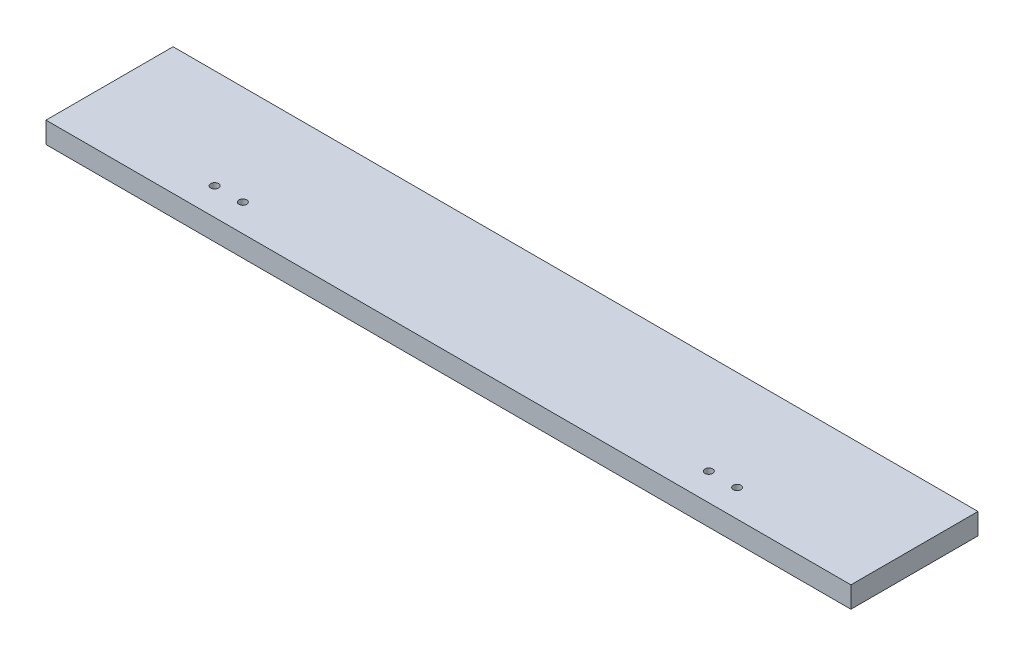
ISO-10303-21;
HEADER;
FILE_DESCRIPTION(('STEP AP214'),'2;1');
FILE_NAME('part.step','',(''),(''),'','','');
FILE_SCHEMA(('AUTOMOTIVE_DESIGN { 1 0 10303 214 1 1 1 1 }'));
ENDSEC;
DATA;
#1=APPLICATION_CONTEXT('core data for automotive mechanical design processes');
#2=APPLICATION_PROTOCOL_DEFINITION('international standard','automotive_design',2000,#1);
#3=PRODUCT_CONTEXT('',#1,'mechanical');
#4=PRODUCT('Part','Part','',(#3));
#5=PRODUCT_RELATED_PRODUCT_CATEGORY('part','',(#4));
#6=PRODUCT_DEFINITION_FORMATION('','',#4);
#7=PRODUCT_DEFINITION_CONTEXT('part definition',#1,'design');
#8=PRODUCT_DEFINITION('design','',#6,#7);
#9=PRODUCT_DEFINITION_SHAPE('','',#8);
#10=(LENGTH_UNIT() NAMED_UNIT(*) SI_UNIT(.MILLI.,.METRE.));
#11=(NAMED_UNIT(*) PLANE_ANGLE_UNIT() SI_UNIT($,.RADIAN.));
#12=(NAMED_UNIT(*) SI_UNIT($,.STERADIAN.) SOLID_ANGLE_UNIT());
#13=UNCERTAINTY_MEASURE_WITH_UNIT(LENGTH_MEASURE(1.E-05),#10,'distance_accuracy_value','');
#14=(GEOMETRIC_REPRESENTATION_CONTEXT(3) GLOBAL_UNCERTAINTY_ASSIGNED_CONTEXT((#13)) GLOBAL_UNIT_ASSIGNED_CONTEXT((#10,
#11,#12)) REPRESENTATION_CONTEXT('',''));
#15=CARTESIAN_POINT('',(0.,0.,0.));
#16=DIRECTION('',(0.,0.,1.));
#17=DIRECTION('',(1.,0.,0.));
#18=AXIS2_PLACEMENT_3D('',#15,#16,#17);
#19=CARTESIAN_POINT('',(361.949999999999,19.05,57.15));
#20=DIRECTION('',(-1.,0.,0.));
#21=DIRECTION('',(0.,0.,1.));
#22=AXIS2_PLACEMENT_3D('',#19,#20,#21);
#23=PLANE('',#22);
#24=DIRECTION('',(0.,0.,-1.));
#25=VECTOR('',#24,1.);
#26=CARTESIAN_POINT('',(361.949999999999,0.,57.15));
#27=LINE('',#26,#25);
#28=CARTESIAN_POINT('',(361.949999999999,0.,57.15));
#29=VERTEX_POINT('',#28);
#30=CARTESIAN_POINT('',(361.949999999999,0.,-57.15));
#31=VERTEX_POINT('',#30);
#32=EDGE_CURVE('E103',#29,#31,#27,.T.);
#33=ORIENTED_EDGE('',*,*,#32,.T.);
#34=DIRECTION('',(0.,-1.,0.));
#35=VECTOR('',#34,1.);
#36=CARTESIAN_POINT('',(361.949999999999,19.05,-57.15));
#37=LINE('',#36,#35);
#38=CARTESIAN_POINT('',(361.949999999999,19.05,-57.15));
#39=VERTEX_POINT('',#38);
#40=EDGE_CURVE('E11',#39,#31,#37,.T.);
#41=ORIENTED_EDGE('',*,*,#40,.F.);
#42=DIRECTION('',(0.,0.,-1.));
#43=VECTOR('',#42,1.);
#44=CARTESIAN_POINT('',(361.949999999999,19.05,57.15));
#45=LINE('',#44,#43);
#46=CARTESIAN_POINT('',(361.949999999999,19.05,57.15));
#47=VERTEX_POINT('',#46);
#48=EDGE_CURVE('E91',#47,#39,#45,.T.);
#49=ORIENTED_EDGE('',*,*,#48,.F.);
#50=DIRECTION('',(0.,-1.,0.));
#51=VECTOR('',#50,1.);
#52=CARTESIAN_POINT('',(361.949999999999,19.05,57.15));
#53=LINE('',#52,#51);
#54=EDGE_CURVE('E99',#47,#29,#53,.T.);
#55=ORIENTED_EDGE('',*,*,#54,.T.);
#56=EDGE_LOOP('',(#33,#41,#49,#55));
#57=FACE_BOUND('',#56,.T.);
#58=ADVANCED_FACE('F40',(#57),#23,.F.);
#59=CARTESIAN_POINT('',(-361.950000000001,19.05,-57.15));
#60=DIRECTION('',(0.,0.,1.));
#61=DIRECTION('',(1.,0.,0.));
#62=AXIS2_PLACEMENT_3D('',#59,#60,#61);
#63=PLANE('',#62);
#64=DIRECTION('',(-1.,0.,0.));
#65=VECTOR('',#64,1.);
#66=CARTESIAN_POINT('',(-361.950000000001,0.,-57.15));
#67=LINE('',#66,#65);
#68=CARTESIAN_POINT('',(-361.950000000001,0.,-57.15));
#69=VERTEX_POINT('',#68);
#70=EDGE_CURVE('E95',#31,#69,#67,.T.);
#71=ORIENTED_EDGE('',*,*,#70,.T.);
#72=DIRECTION('',(0.,-1.,0.));
#73=VECTOR('',#72,1.);
#74=CARTESIAN_POINT('',(-361.950000000001,19.05,-57.15));
#75=LINE('',#74,#73);
#76=CARTESIAN_POINT('',(-361.950000000001,19.05,-57.15));
#77=VERTEX_POINT('',#76);
#78=EDGE_CURVE('E48',#77,#69,#75,.T.);
#79=ORIENTED_EDGE('',*,*,#78,.F.);
#80=DIRECTION('',(-1.,0.,0.));
#81=VECTOR('',#80,1.);
#82=CARTESIAN_POINT('',(-361.950000000001,19.05,-57.15));
#83=LINE('',#82,#81);
#84=EDGE_CURVE('E86',#39,#77,#83,.T.);
#85=ORIENTED_EDGE('',*,*,#84,.F.);
#86=ORIENTED_EDGE('',*,*,#40,.T.);
#87=EDGE_LOOP('',(#71,#79,#85,#86));
#88=FACE_BOUND('',#87,.T.);
#89=ADVANCED_FACE('F94',(#88),#63,.F.);
#90=CARTESIAN_POINT('',(-361.950000000001,19.05,57.15));
#91=DIRECTION('',(1.,0.,0.));
#92=DIRECTION('',(0.,0.,-1.));
#93=AXIS2_PLACEMENT_3D('',#90,#91,#92);
#94=PLANE('',#93);
#95=DIRECTION('',(0.,0.,1.));
#96=VECTOR('',#95,1.);
#97=CARTESIAN_POINT('',(-361.950000000001,0.,57.15));
#98=LINE('',#97,#96);
#99=CARTESIAN_POINT('',(-361.950000000001,0.,57.15));
#100=VERTEX_POINT('',#99);
#101=EDGE_CURVE('E73',#69,#100,#98,.T.);
#102=ORIENTED_EDGE('',*,*,#101,.T.);
#103=DIRECTION('',(0.,-1.,0.));
#104=VECTOR('',#103,1.);
#105=CARTESIAN_POINT('',(-361.950000000001,19.05,57.15));
#106=LINE('',#105,#104);
#107=CARTESIAN_POINT('',(-361.950000000001,19.05,57.15));
#108=VERTEX_POINT('',#107);
#109=EDGE_CURVE('E96',#108,#100,#106,.T.);
#110=ORIENTED_EDGE('',*,*,#109,.F.);
#111=DIRECTION('',(0.,0.,1.));
#112=VECTOR('',#111,1.);
#113=CARTESIAN_POINT('',(-361.950000000001,19.05,57.15));
#114=LINE('',#113,#112);
#115=EDGE_CURVE('E89',#77,#108,#114,.T.);
#116=ORIENTED_EDGE('',*,*,#115,.F.);
#117=ORIENTED_EDGE('',*,*,#78,.T.);
#118=EDGE_LOOP('',(#102,#110,#116,#117));
#119=FACE_BOUND('',#118,.T.);
#120=ADVANCED_FACE('F97',(#119),#94,.F.);
#121=CARTESIAN_POINT('',(-361.950000000001,19.05,57.15));
#122=DIRECTION('',(0.,0.,-1.));
#123=DIRECTION('',(-1.,0.,0.));
#124=AXIS2_PLACEMENT_3D('',#121,#122,#123);
#125=PLANE('',#124);
#126=DIRECTION('',(1.,0.,0.));
#127=VECTOR('',#126,1.);
#128=CARTESIAN_POINT('',(-361.950000000001,0.,57.15));
#129=LINE('',#128,#127);
#130=EDGE_CURVE('E79',#100,#29,#129,.T.);
#131=ORIENTED_EDGE('',*,*,#130,.T.);
#132=ORIENTED_EDGE('',*,*,#54,.F.);
#133=DIRECTION('',(1.,0.,0.));
#134=VECTOR('',#133,1.);
#135=CARTESIAN_POINT('',(-361.950000000001,19.05,57.15));
#136=LINE('',#135,#134);
#137=EDGE_CURVE('E56',#108,#47,#136,.T.);
#138=ORIENTED_EDGE('',*,*,#137,.F.);
#139=ORIENTED_EDGE('',*,*,#109,.T.);
#140=EDGE_LOOP('',(#131,#132,#138,#139));
#141=FACE_BOUND('',#140,.T.);
#142=ADVANCED_FACE('F111',(#141),#125,.F.);
#143=CARTESIAN_POINT('',(0.,19.05,0.));
#144=DIRECTION('',(0.,-1.,0.));
#145=DIRECTION('',(0.,0.,-1.));
#146=AXIS2_PLACEMENT_3D('',#143,#144,#145);
#147=PLANE('',#146);
#148=CARTESIAN_POINT('',(-234.950000000001,19.05,32.512));
#149=DIRECTION('',(0.,-1.,0.));
#150=DIRECTION('',(0.,0.,-1.));
#151=AXIS2_PLACEMENT_3D('',#148,#149,#150);
#152=CIRCLE('',#151,3.49249999999998);
#153=CARTESIAN_POINT('',(-234.950000000001,19.05,29.0195000000001));
#154=VERTEX_POINT('',#153);
#155=EDGE_CURVE('E106',#154,#154,#152,.T.);
#156=ORIENTED_EDGE('',*,*,#155,.T.);
#157=EDGE_LOOP('',(#156));
#158=FACE_BOUND('',#157,.T.);
#159=CARTESIAN_POINT('',(-209.55,19.05,32.512));
#160=DIRECTION('',(0.,-1.,0.));
#161=DIRECTION('',(0.,0.,-1.));
#162=AXIS2_PLACEMENT_3D('',#159,#160,#161);
#163=CIRCLE('',#162,3.49249999999998);
#164=CARTESIAN_POINT('',(-209.55,19.05,29.0195000000001));
#165=VERTEX_POINT('',#164);
#166=EDGE_CURVE('E129',#165,#165,#163,.T.);
#167=ORIENTED_EDGE('',*,*,#166,.T.);
#168=EDGE_LOOP('',(#167));
#169=FACE_BOUND('',#168,.T.);
#170=CARTESIAN_POINT('',(209.549999999999,19.05,32.512));
#171=DIRECTION('',(0.,-1.,0.));
#172=DIRECTION('',(0.,0.,-1.));
#173=AXIS2_PLACEMENT_3D('',#170,#171,#172);
#174=CIRCLE('',#173,3.49249999999998);
#175=CARTESIAN_POINT('',(209.549999999999,19.05,29.0195000000001));
#176=VERTEX_POINT('',#175);
#177=EDGE_CURVE('E123',#176,#176,#174,.T.);
#178=ORIENTED_EDGE('',*,*,#177,.T.);
#179=EDGE_LOOP('',(#178));
#180=FACE_BOUND('',#179,.T.);
#181=CARTESIAN_POINT('',(234.95,19.05,32.512));
#182=DIRECTION('',(0.,-1.,0.));
#183=DIRECTION('',(0.,0.,-1.));
#184=AXIS2_PLACEMENT_3D('',#181,#182,#183);
#185=CIRCLE('',#184,3.49249999999998);
#186=CARTESIAN_POINT('',(234.95,19.05,29.0195000000001));
#187=VERTEX_POINT('',#186);
#188=EDGE_CURVE('E117',#187,#187,#185,.T.);
#189=ORIENTED_EDGE('',*,*,#188,.T.);
#190=EDGE_LOOP('',(#189));
#191=FACE_BOUND('',#190,.T.);
#192=ORIENTED_EDGE('',*,*,#48,.T.);
#193=ORIENTED_EDGE('',*,*,#84,.T.);
#194=ORIENTED_EDGE('',*,*,#115,.T.);
#195=ORIENTED_EDGE('',*,*,#137,.T.);
#196=EDGE_LOOP('',(#192,#193,#194,#195));
#197=FACE_BOUND('',#196,.T.);
#198=ADVANCED_FACE('F87',(#158,#169,#180,#191,#197),#147,.F.);
#199=CARTESIAN_POINT('',(0.,0.,0.));
#200=DIRECTION('',(0.,-1.,0.));
#201=DIRECTION('',(0.,0.,-1.));
#202=AXIS2_PLACEMENT_3D('',#199,#200,#201);
#203=PLANE('',#202);
#204=CARTESIAN_POINT('',(-234.950000000001,0.,32.512));
#205=DIRECTION('',(0.,-1.,0.));
#206=DIRECTION('',(0.,0.,-1.));
#207=AXIS2_PLACEMENT_3D('',#204,#205,#206);
#208=CIRCLE('',#207,3.49249999999998);
#209=CARTESIAN_POINT('',(-234.950000000001,0.,29.0195000000001));
#210=VERTEX_POINT('',#209);
#211=EDGE_CURVE('E135',#210,#210,#208,.T.);
#212=ORIENTED_EDGE('',*,*,#211,.F.);
#213=EDGE_LOOP('',(#212));
#214=FACE_BOUND('',#213,.T.);
#215=CARTESIAN_POINT('',(-209.55,0.,32.512));
#216=DIRECTION('',(0.,-1.,0.));
#217=DIRECTION('',(0.,0.,-1.));
#218=AXIS2_PLACEMENT_3D('',#215,#216,#217);
#219=CIRCLE('',#218,3.49249999999998);
#220=CARTESIAN_POINT('',(-209.55,0.,29.0195000000001));
#221=VERTEX_POINT('',#220);
#222=EDGE_CURVE('E132',#221,#221,#219,.T.);
#223=ORIENTED_EDGE('',*,*,#222,.F.);
#224=EDGE_LOOP('',(#223));
#225=FACE_BOUND('',#224,.T.);
#226=CARTESIAN_POINT('',(209.549999999999,0.,32.512));
#227=DIRECTION('',(0.,-1.,0.));
#228=DIRECTION('',(0.,0.,-1.));
#229=AXIS2_PLACEMENT_3D('',#226,#227,#228);
#230=CIRCLE('',#229,3.49249999999998);
#231=CARTESIAN_POINT('',(209.549999999999,0.,29.0195000000001));
#232=VERTEX_POINT('',#231);
#233=EDGE_CURVE('E126',#232,#232,#230,.T.);
#234=ORIENTED_EDGE('',*,*,#233,.F.);
#235=EDGE_LOOP('',(#234));
#236=FACE_BOUND('',#235,.T.);
#237=CARTESIAN_POINT('',(234.95,0.,32.512));
#238=DIRECTION('',(0.,-1.,0.));
#239=DIRECTION('',(0.,0.,-1.));
#240=AXIS2_PLACEMENT_3D('',#237,#238,#239);
#241=CIRCLE('',#240,3.49249999999998);
#242=CARTESIAN_POINT('',(234.95,0.,29.0195000000001));
#243=VERTEX_POINT('',#242);
#244=EDGE_CURVE('E120',#243,#243,#241,.T.);
#245=ORIENTED_EDGE('',*,*,#244,.F.);
#246=EDGE_LOOP('',(#245));
#247=FACE_BOUND('',#246,.T.);
#248=ORIENTED_EDGE('',*,*,#32,.F.);
#249=ORIENTED_EDGE('',*,*,#130,.F.);
#250=ORIENTED_EDGE('',*,*,#101,.F.);
#251=ORIENTED_EDGE('',*,*,#70,.F.);
#252=EDGE_LOOP('',(#248,#249,#250,#251));
#253=FACE_BOUND('',#252,.T.);
#254=ADVANCED_FACE('F114',(#214,#225,#236,#247,#253),#203,.T.);
#255=CARTESIAN_POINT('',(234.95,19.05,32.512));
#256=DIRECTION('',(0.,-1.,0.));
#257=DIRECTION('',(0.,0.,-1.));
#258=AXIS2_PLACEMENT_3D('',#255,#256,#257);
#259=CYLINDRICAL_SURFACE('',#258,3.49249999999998);
#260=CARTESIAN_POINT('',(234.95,19.05,29.0195000000001));
#261=CARTESIAN_POINT('',(234.95,18.8515625,29.0195000000001));
#262=CARTESIAN_POINT('',(234.95,18.653125,29.0195000000001));
#263=CARTESIAN_POINT('',(234.95,18.25625,29.0195000000001));
#264=CARTESIAN_POINT('',(234.95,18.0578125,29.0195000000001));
#265=CARTESIAN_POINT('',(234.95,17.6609375,29.0195000000001));
#266=CARTESIAN_POINT('',(234.95,17.4625,29.0195000000001));
#267=CARTESIAN_POINT('',(234.95,17.065625,29.0195000000001));
#268=CARTESIAN_POINT('',(234.95,16.8671875,29.0195000000001));
#269=CARTESIAN_POINT('',(234.95,16.4703125,29.0195000000001));
#270=CARTESIAN_POINT('',(234.95,16.271875,29.0195000000001));
#271=CARTESIAN_POINT('',(234.95,15.875,29.0195000000001));
#272=CARTESIAN_POINT('',(234.95,15.6765625,29.0195000000001));
#273=CARTESIAN_POINT('',(234.95,15.2796875,29.0195000000001));
#274=CARTESIAN_POINT('',(234.95,15.08125,29.0195000000001));
#275=CARTESIAN_POINT('',(234.95,14.684375,29.0195000000001));
#276=CARTESIAN_POINT('',(234.95,14.4859375,29.0195000000001));
#277=CARTESIAN_POINT('',(234.95,14.0890625,29.0195000000001));
#278=CARTESIAN_POINT('',(234.95,13.890625,29.0195000000001));
#279=CARTESIAN_POINT('',(234.95,13.49375,29.0195000000001));
#280=CARTESIAN_POINT('',(234.95,13.2953125,29.0195000000001));
#281=CARTESIAN_POINT('',(234.95,12.8984375,29.0195000000001));
#282=CARTESIAN_POINT('',(234.95,12.7,29.0195000000001));
#283=CARTESIAN_POINT('',(234.95,12.303125,29.0195000000001));
#284=CARTESIAN_POINT('',(234.95,12.1046875,29.0195000000001));
#285=CARTESIAN_POINT('',(234.95,11.7078125,29.0195000000001));
#286=CARTESIAN_POINT('',(234.95,11.509375,29.0195000000001));
#287=CARTESIAN_POINT('',(234.95,11.1125,29.0195000000001));
#288=CARTESIAN_POINT('',(234.95,10.9140625,29.0195000000001));
#289=CARTESIAN_POINT('',(234.95,10.5171875,29.0195000000001));
#290=CARTESIAN_POINT('',(234.95,10.31875,29.0195000000001));
#291=CARTESIAN_POINT('',(234.95,9.921875,29.0195000000001));
#292=CARTESIAN_POINT('',(234.95,9.7234375,29.0195000000001));
#293=CARTESIAN_POINT('',(234.95,9.3265625,29.0195000000001));
#294=CARTESIAN_POINT('',(234.95,9.128125,29.0195000000001));
#295=CARTESIAN_POINT('',(234.95,8.73125,29.0195000000001));
#296=CARTESIAN_POINT('',(234.95,8.5328125,29.0195000000001));
#297=CARTESIAN_POINT('',(234.95,8.1359375,29.0195000000001));
#298=CARTESIAN_POINT('',(234.95,7.9375,29.0195000000001));
#299=CARTESIAN_POINT('',(234.95,7.540625,29.0195000000001));
#300=CARTESIAN_POINT('',(234.95,7.3421875,29.0195000000001));
#301=CARTESIAN_POINT('',(234.95,6.9453125,29.0195000000001));
#302=CARTESIAN_POINT('',(234.95,6.746875,29.0195000000001));
#303=CARTESIAN_POINT('',(234.95,6.35,29.0195000000001));
#304=CARTESIAN_POINT('',(234.95,6.1515625,29.0195000000001));
#305=CARTESIAN_POINT('',(234.95,5.7546875,29.0195000000001));
#306=CARTESIAN_POINT('',(234.95,5.55625,29.0195000000001));
#307=CARTESIAN_POINT('',(234.95,5.159375,29.0195000000001));
#308=CARTESIAN_POINT('',(234.95,4.9609375,29.0195000000001));
#309=CARTESIAN_POINT('',(234.95,4.5640625,29.0195000000001));
#310=CARTESIAN_POINT('',(234.95,4.365625,29.0195000000001));
#311=CARTESIAN_POINT('',(234.95,3.96875,29.0195000000001));
#312=CARTESIAN_POINT('',(234.95,3.7703125,29.0195000000001));
#313=CARTESIAN_POINT('',(234.95,3.3734375,29.0195000000001));
#314=CARTESIAN_POINT('',(234.95,3.175,29.0195000000001));
#315=CARTESIAN_POINT('',(234.95,2.778125,29.0195000000001));
#316=CARTESIAN_POINT('',(234.95,2.5796875,29.0195000000001));
#317=CARTESIAN_POINT('',(234.95,2.1828125,29.0195000000001));
#318=CARTESIAN_POINT('',(234.95,1.984375,29.0195000000001));
#319=CARTESIAN_POINT('',(234.95,1.5875,29.0195000000001));
#320=CARTESIAN_POINT('',(234.95,1.3890625,29.0195000000001));
#321=CARTESIAN_POINT('',(234.95,0.992187500000001,29.0195000000001));
#322=CARTESIAN_POINT('',(234.95,0.793750000000001,29.0195000000001));
#323=CARTESIAN_POINT('',(234.95,0.396875,29.0195000000001));
#324=CARTESIAN_POINT('',(234.95,0.1984375,29.0195000000001));
#325=CARTESIAN_POINT('',(234.95,0.,29.0195000000001));
#326=B_SPLINE_CURVE_WITH_KNOTS('',3,(#260,#261,#262,#263,#264,#265,#266,#267,#268,#269,#270,
#271,#272,#273,#274,#275,#276,#277,#278,#279,#280,#281,#282,#283,#284,#285,#286,#287,#288,#289,
#290,#291,#292,#293,#294,#295,#296,#297,#298,#299,#300,#301,#302,#303,#304,#305,#306,#307,#308,
#309,#310,#311,#312,#313,#314,#315,#316,#317,#318,#319,#320,#321,#322,#323,#324,#325),
.UNSPECIFIED.,.F.,.F.,(4,2,2,2,2,2,2,2,2,2,2,2,2,2,2,2,2,2,2,2,2,2,2,2,2,2,2,2,2,2,2,2,4),(0.,
0.5953125,1.190625,1.7859375,2.38125,2.9765625,3.571875,4.1671875,4.7625,5.3578125,5.953125,
6.5484375,7.14375,7.7390625,8.334375,8.9296875,9.525,10.1203125,10.715625,11.3109375,11.90625,
12.5015625,13.096875,13.6921875,14.2875,14.8828125,15.478125,16.0734375,16.66875,17.2640625,
17.859375,18.4546875,19.05),.UNSPECIFIED.);
#327=EDGE_CURVE('BSEAM152',#187,#243,#326,.T.);
#328=ORIENTED_EDGE('',*,*,#188,.F.);
#329=ORIENTED_EDGE('',*,*,#244,.T.);
#330=ORIENTED_EDGE('',*,*,#327,.T.);
#331=ORIENTED_EDGE('',*,*,#327,.F.);
#332=EDGE_LOOP('',(#328,#330,#329,#331));
#333=FACE_BOUND('',#332,.T.);
#334=ADVANCED_FACE('F152',(#333),#259,.F.);
#335=CARTESIAN_POINT('',(209.549999999999,19.05,32.512));
#336=DIRECTION('',(0.,-1.,0.));
#337=DIRECTION('',(0.,0.,-1.));
#338=AXIS2_PLACEMENT_3D('',#335,#336,#337);
#339=CYLINDRICAL_SURFACE('',#338,3.49249999999998);
#340=CARTESIAN_POINT('',(209.549999999999,19.05,29.0195000000001));
#341=CARTESIAN_POINT('',(209.549999999999,18.8515625,29.0195000000001));
#342=CARTESIAN_POINT('',(209.549999999999,18.653125,29.0195000000001));
#343=CARTESIAN_POINT('',(209.549999999999,18.25625,29.0195000000001));
#344=CARTESIAN_POINT('',(209.549999999999,18.0578125,29.0195000000001));
#345=CARTESIAN_POINT('',(209.549999999999,17.6609375,29.0195000000001));
#346=CARTESIAN_POINT('',(209.549999999999,17.4625,29.0195000000001));
#347=CARTESIAN_POINT('',(209.549999999999,17.065625,29.0195000000001));
#348=CARTESIAN_POINT('',(209.549999999999,16.8671875,29.0195000000001));
#349=CARTESIAN_POINT('',(209.549999999999,16.4703125,29.0195000000001));
#350=CARTESIAN_POINT('',(209.549999999999,16.271875,29.0195000000001));
#351=CARTESIAN_POINT('',(209.549999999999,15.875,29.0195000000001));
#352=CARTESIAN_POINT('',(209.549999999999,15.6765625,29.0195000000001));
#353=CARTESIAN_POINT('',(209.549999999999,15.2796875,29.0195000000001));
#354=CARTESIAN_POINT('',(209.549999999999,15.08125,29.0195000000001));
#355=CARTESIAN_POINT('',(209.549999999999,14.684375,29.0195000000001));
#356=CARTESIAN_POINT('',(209.549999999999,14.4859375,29.0195000000001));
#357=CARTESIAN_POINT('',(209.549999999999,14.0890625,29.0195000000001));
#358=CARTESIAN_POINT('',(209.549999999999,13.890625,29.0195000000001));
#359=CARTESIAN_POINT('',(209.549999999999,13.49375,29.0195000000001));
#360=CARTESIAN_POINT('',(209.549999999999,13.2953125,29.0195000000001));
#361=CARTESIAN_POINT('',(209.549999999999,12.8984375,29.0195000000001));
#362=CARTESIAN_POINT('',(209.549999999999,12.7,29.0195000000001));
#363=CARTESIAN_POINT('',(209.549999999999,12.303125,29.0195000000001));
#364=CARTESIAN_POINT('',(209.549999999999,12.1046875,29.0195000000001));
#365=CARTESIAN_POINT('',(209.549999999999,11.7078125,29.0195000000001));
#366=CARTESIAN_POINT('',(209.549999999999,11.509375,29.0195000000001));
#367=CARTESIAN_POINT('',(209.549999999999,11.1125,29.0195000000001));
#368=CARTESIAN_POINT('',(209.549999999999,10.9140625,29.0195000000001));
#369=CARTESIAN_POINT('',(209.549999999999,10.5171875,29.0195000000001));
#370=CARTESIAN_POINT('',(209.549999999999,10.31875,29.0195000000001));
#371=CARTESIAN_POINT('',(209.549999999999,9.921875,29.0195000000001));
#372=CARTESIAN_POINT('',(209.549999999999,9.7234375,29.0195000000001));
#373=CARTESIAN_POINT('',(209.549999999999,9.3265625,29.0195000000001));
#374=CARTESIAN_POINT('',(209.549999999999,9.128125,29.0195000000001));
#375=CARTESIAN_POINT('',(209.549999999999,8.73125,29.0195000000001));
#376=CARTESIAN_POINT('',(209.549999999999,8.5328125,29.0195000000001));
#377=CARTESIAN_POINT('',(209.549999999999,8.1359375,29.0195000000001));
#378=CARTESIAN_POINT('',(209.549999999999,7.9375,29.0195000000001));
#379=CARTESIAN_POINT('',(209.549999999999,7.540625,29.0195000000001));
#380=CARTESIAN_POINT('',(209.549999999999,7.3421875,29.0195000000001));
#381=CARTESIAN_POINT('',(209.549999999999,6.9453125,29.0195000000001));
#382=CARTESIAN_POINT('',(209.549999999999,6.746875,29.0195000000001));
#383=CARTESIAN_POINT('',(209.549999999999,6.35,29.0195000000001));
#384=CARTESIAN_POINT('',(209.549999999999,6.1515625,29.0195000000001));
#385=CARTESIAN_POINT('',(209.549999999999,5.7546875,29.0195000000001));
#386=CARTESIAN_POINT('',(209.549999999999,5.55625,29.0195000000001));
#387=CARTESIAN_POINT('',(209.549999999999,5.159375,29.0195000000001));
#388=CARTESIAN_POINT('',(209.549999999999,4.9609375,29.0195000000001));
#389=CARTESIAN_POINT('',(209.549999999999,4.5640625,29.0195000000001));
#390=CARTESIAN_POINT('',(209.549999999999,4.365625,29.0195000000001));
#391=CARTESIAN_POINT('',(209.549999999999,3.96875,29.0195000000001));
#392=CARTESIAN_POINT('',(209.549999999999,3.7703125,29.0195000000001));
#393=CARTESIAN_POINT('',(209.549999999999,3.3734375,29.0195000000001));
#394=CARTESIAN_POINT('',(209.549999999999,3.175,29.0195000000001));
#395=CARTESIAN_POINT('',(209.549999999999,2.778125,29.0195000000001));
#396=CARTESIAN_POINT('',(209.549999999999,2.5796875,29.0195000000001));
#397=CARTESIAN_POINT('',(209.549999999999,2.1828125,29.0195000000001));
#398=CARTESIAN_POINT('',(209.549999999999,1.984375,29.0195000000001));
#399=CARTESIAN_POINT('',(209.549999999999,1.5875,29.0195000000001));
#400=CARTESIAN_POINT('',(209.549999999999,1.3890625,29.0195000000001));
#401=CARTESIAN_POINT('',(209.549999999999,0.992187500000001,29.0195000000001));
#402=CARTESIAN_POINT('',(209.549999999999,0.793750000000001,29.0195000000001));
#403=CARTESIAN_POINT('',(209.549999999999,0.396875,29.0195000000001));
#404=CARTESIAN_POINT('',(209.549999999999,0.1984375,29.0195000000001));
#405=CARTESIAN_POINT('',(209.549999999999,0.,29.0195000000001));
#406=B_SPLINE_CURVE_WITH_KNOTS('',3,(#340,#341,#342,#343,#344,#345,#346,#347,#348,#349,#350,
#351,#352,#353,#354,#355,#356,#357,#358,#359,#360,#361,#362,#363,#364,#365,#366,#367,#368,#369,
#370,#371,#372,#373,#374,#375,#376,#377,#378,#379,#380,#381,#382,#383,#384,#385,#386,#387,#388,
#389,#390,#391,#392,#393,#394,#395,#396,#397,#398,#399,#400,#401,#402,#403,#404,#405),
.UNSPECIFIED.,.F.,.F.,(4,2,2,2,2,2,2,2,2,2,2,2,2,2,2,2,2,2,2,2,2,2,2,2,2,2,2,2,2,2,2,2,4),(0.,
0.5953125,1.190625,1.7859375,2.38125,2.9765625,3.571875,4.1671875,4.7625,5.3578125,5.953125,
6.5484375,7.14375,7.7390625,8.334375,8.9296875,9.525,10.1203125,10.715625,11.3109375,11.90625,
12.5015625,13.096875,13.6921875,14.2875,14.8828125,15.478125,16.0734375,16.66875,17.2640625,
17.859375,18.4546875,19.05),.UNSPECIFIED.);
#407=EDGE_CURVE('BSEAM161',#176,#232,#406,.T.);
#408=ORIENTED_EDGE('',*,*,#177,.F.);
#409=ORIENTED_EDGE('',*,*,#233,.T.);
#410=ORIENTED_EDGE('',*,*,#407,.T.);
#411=ORIENTED_EDGE('',*,*,#407,.F.);
#412=EDGE_LOOP('',(#408,#410,#409,#411));
#413=FACE_BOUND('',#412,.T.);
#414=ADVANCED_FACE('F161',(#413),#339,.F.);
#415=CARTESIAN_POINT('',(-209.55,19.05,32.512));
#416=DIRECTION('',(0.,-1.,0.));
#417=DIRECTION('',(0.,0.,-1.));
#418=AXIS2_PLACEMENT_3D('',#415,#416,#417);
#419=CYLINDRICAL_SURFACE('',#418,3.49249999999998);
#420=CARTESIAN_POINT('',(-209.55,19.05,29.0195000000001));
#421=CARTESIAN_POINT('',(-209.55,18.8515625,29.0195000000001));
#422=CARTESIAN_POINT('',(-209.55,18.653125,29.0195000000001));
#423=CARTESIAN_POINT('',(-209.55,18.25625,29.0195000000001));
#424=CARTESIAN_POINT('',(-209.55,18.0578125,29.0195000000001));
#425=CARTESIAN_POINT('',(-209.55,17.6609375,29.0195000000001));
#426=CARTESIAN_POINT('',(-209.55,17.4625,29.0195000000001));
#427=CARTESIAN_POINT('',(-209.55,17.065625,29.0195000000001));
#428=CARTESIAN_POINT('',(-209.55,16.8671875,29.0195000000001));
#429=CARTESIAN_POINT('',(-209.55,16.4703125,29.0195000000001));
#430=CARTESIAN_POINT('',(-209.55,16.271875,29.0195000000001));
#431=CARTESIAN_POINT('',(-209.55,15.875,29.0195000000001));
#432=CARTESIAN_POINT('',(-209.55,15.6765625,29.0195000000001));
#433=CARTESIAN_POINT('',(-209.55,15.2796875,29.0195000000001));
#434=CARTESIAN_POINT('',(-209.55,15.08125,29.0195000000001));
#435=CARTESIAN_POINT('',(-209.55,14.684375,29.0195000000001));
#436=CARTESIAN_POINT('',(-209.55,14.4859375,29.0195000000001));
#437=CARTESIAN_POINT('',(-209.55,14.0890625,29.0195000000001));
#438=CARTESIAN_POINT('',(-209.55,13.890625,29.0195000000001));
#439=CARTESIAN_POINT('',(-209.55,13.49375,29.0195000000001));
#440=CARTESIAN_POINT('',(-209.55,13.2953125,29.0195000000001));
#441=CARTESIAN_POINT('',(-209.55,12.8984375,29.0195000000001));
#442=CARTESIAN_POINT('',(-209.55,12.7,29.0195000000001));
#443=CARTESIAN_POINT('',(-209.55,12.303125,29.0195000000001));
#444=CARTESIAN_POINT('',(-209.55,12.1046875,29.0195000000001));
#445=CARTESIAN_POINT('',(-209.55,11.7078125,29.0195000000001));
#446=CARTESIAN_POINT('',(-209.55,11.509375,29.0195000000001));
#447=CARTESIAN_POINT('',(-209.55,11.1125,29.0195000000001));
#448=CARTESIAN_POINT('',(-209.55,10.9140625,29.0195000000001));
#449=CARTESIAN_POINT('',(-209.55,10.5171875,29.0195000000001));
#450=CARTESIAN_POINT('',(-209.55,10.31875,29.0195000000001));
#451=CARTESIAN_POINT('',(-209.55,9.921875,29.0195000000001));
#452=CARTESIAN_POINT('',(-209.55,9.7234375,29.0195000000001));
#453=CARTESIAN_POINT('',(-209.55,9.3265625,29.0195000000001));
#454=CARTESIAN_POINT('',(-209.55,9.128125,29.0195000000001));
#455=CARTESIAN_POINT('',(-209.55,8.73125,29.0195000000001));
#456=CARTESIAN_POINT('',(-209.55,8.5328125,29.0195000000001));
#457=CARTESIAN_POINT('',(-209.55,8.1359375,29.0195000000001));
#458=CARTESIAN_POINT('',(-209.55,7.9375,29.0195000000001));
#459=CARTESIAN_POINT('',(-209.55,7.540625,29.0195000000001));
#460=CARTESIAN_POINT('',(-209.55,7.3421875,29.0195000000001));
#461=CARTESIAN_POINT('',(-209.55,6.9453125,29.0195000000001));
#462=CARTESIAN_POINT('',(-209.55,6.746875,29.0195000000001));
#463=CARTESIAN_POINT('',(-209.55,6.35,29.0195000000001));
#464=CARTESIAN_POINT('',(-209.55,6.1515625,29.0195000000001));
#465=CARTESIAN_POINT('',(-209.55,5.7546875,29.0195000000001));
#466=CARTESIAN_POINT('',(-209.55,5.55625,29.0195000000001));
#467=CARTESIAN_POINT('',(-209.55,5.159375,29.0195000000001));
#468=CARTESIAN_POINT('',(-209.55,4.9609375,29.0195000000001));
#469=CARTESIAN_POINT('',(-209.55,4.5640625,29.0195000000001));
#470=CARTESIAN_POINT('',(-209.55,4.365625,29.0195000000001));
#471=CARTESIAN_POINT('',(-209.55,3.96875,29.0195000000001));
#472=CARTESIAN_POINT('',(-209.55,3.7703125,29.0195000000001));
#473=CARTESIAN_POINT('',(-209.55,3.3734375,29.0195000000001));
#474=CARTESIAN_POINT('',(-209.55,3.175,29.0195000000001));
#475=CARTESIAN_POINT('',(-209.55,2.778125,29.0195000000001));
#476=CARTESIAN_POINT('',(-209.55,2.5796875,29.0195000000001));
#477=CARTESIAN_POINT('',(-209.55,2.1828125,29.0195000000001));
#478=CARTESIAN_POINT('',(-209.55,1.984375,29.0195000000001));
#479=CARTESIAN_POINT('',(-209.55,1.5875,29.0195000000001));
#480=CARTESIAN_POINT('',(-209.55,1.3890625,29.0195000000001));
#481=CARTESIAN_POINT('',(-209.55,0.992187500000001,29.0195000000001));
#482=CARTESIAN_POINT('',(-209.55,0.793750000000001,29.0195000000001));
#483=CARTESIAN_POINT('',(-209.55,0.396875,29.0195000000001));
#484=CARTESIAN_POINT('',(-209.55,0.1984375,29.0195000000001));
#485=CARTESIAN_POINT('',(-209.55,0.,29.0195000000001));
#486=B_SPLINE_CURVE_WITH_KNOTS('',3,(#420,#421,#422,#423,#424,#425,#426,#427,#428,#429,#430,
#431,#432,#433,#434,#435,#436,#437,#438,#439,#440,#441,#442,#443,#444,#445,#446,#447,#448,#449,
#450,#451,#452,#453,#454,#455,#456,#457,#458,#459,#460,#461,#462,#463,#464,#465,#466,#467,#468,
#469,#470,#471,#472,#473,#474,#475,#476,#477,#478,#479,#480,#481,#482,#483,#484,#485),
.UNSPECIFIED.,.F.,.F.,(4,2,2,2,2,2,2,2,2,2,2,2,2,2,2,2,2,2,2,2,2,2,2,2,2,2,2,2,2,2,2,2,4),(0.,
0.5953125,1.190625,1.7859375,2.38125,2.9765625,3.571875,4.1671875,4.7625,5.3578125,5.953125,
6.5484375,7.14375,7.7390625,8.334375,8.9296875,9.525,10.1203125,10.715625,11.3109375,11.90625,
12.5015625,13.096875,13.6921875,14.2875,14.8828125,15.478125,16.0734375,16.66875,17.2640625,
17.859375,18.4546875,19.05),.UNSPECIFIED.);
#487=EDGE_CURVE('BSEAM146',#165,#221,#486,.T.);
#488=ORIENTED_EDGE('',*,*,#166,.F.);
#489=ORIENTED_EDGE('',*,*,#222,.T.);
#490=ORIENTED_EDGE('',*,*,#487,.T.);
#491=ORIENTED_EDGE('',*,*,#487,.F.);
#492=EDGE_LOOP('',(#488,#490,#489,#491));
#493=FACE_BOUND('',#492,.T.);
#494=ADVANCED_FACE('F146',(#493),#419,.F.);
#495=CARTESIAN_POINT('',(-234.950000000001,19.05,32.512));
#496=DIRECTION('',(0.,-1.,0.));
#497=DIRECTION('',(0.,0.,-1.));
#498=AXIS2_PLACEMENT_3D('',#495,#496,#497);
#499=CYLINDRICAL_SURFACE('',#498,3.49249999999998);
#500=CARTESIAN_POINT('',(-234.950000000001,19.05,29.0195000000001));
#501=CARTESIAN_POINT('',(-234.950000000001,18.8515625,29.0195000000001));
#502=CARTESIAN_POINT('',(-234.950000000001,18.653125,29.0195000000001));
#503=CARTESIAN_POINT('',(-234.950000000001,18.25625,29.0195000000001));
#504=CARTESIAN_POINT('',(-234.950000000001,18.0578125,29.0195000000001));
#505=CARTESIAN_POINT('',(-234.950000000001,17.6609375,29.0195000000001));
#506=CARTESIAN_POINT('',(-234.950000000001,17.4625,29.0195000000001));
#507=CARTESIAN_POINT('',(-234.950000000001,17.065625,29.0195000000001));
#508=CARTESIAN_POINT('',(-234.950000000001,16.8671875,29.0195000000001));
#509=CARTESIAN_POINT('',(-234.950000000001,16.4703125,29.0195000000001));
#510=CARTESIAN_POINT('',(-234.950000000001,16.271875,29.0195000000001));
#511=CARTESIAN_POINT('',(-234.950000000001,15.875,29.0195000000001));
#512=CARTESIAN_POINT('',(-234.950000000001,15.6765625,29.0195000000001));
#513=CARTESIAN_POINT('',(-234.950000000001,15.2796875,29.0195000000001));
#514=CARTESIAN_POINT('',(-234.950000000001,15.08125,29.0195000000001));
#515=CARTESIAN_POINT('',(-234.950000000001,14.684375,29.0195000000001));
#516=CARTESIAN_POINT('',(-234.950000000001,14.4859375,29.0195000000001));
#517=CARTESIAN_POINT('',(-234.950000000001,14.0890625,29.0195000000001));
#518=CARTESIAN_POINT('',(-234.950000000001,13.890625,29.0195000000001));
#519=CARTESIAN_POINT('',(-234.950000000001,13.49375,29.0195000000001));
#520=CARTESIAN_POINT('',(-234.950000000001,13.2953125,29.0195000000001));
#521=CARTESIAN_POINT('',(-234.950000000001,12.8984375,29.0195000000001));
#522=CARTESIAN_POINT('',(-234.950000000001,12.7,29.0195000000001));
#523=CARTESIAN_POINT('',(-234.950000000001,12.303125,29.0195000000001));
#524=CARTESIAN_POINT('',(-234.950000000001,12.1046875,29.0195000000001));
#525=CARTESIAN_POINT('',(-234.950000000001,11.7078125,29.0195000000001));
#526=CARTESIAN_POINT('',(-234.950000000001,11.509375,29.0195000000001));
#527=CARTESIAN_POINT('',(-234.950000000001,11.1125,29.0195000000001));
#528=CARTESIAN_POINT('',(-234.950000000001,10.9140625,29.0195000000001));
#529=CARTESIAN_POINT('',(-234.950000000001,10.5171875,29.0195000000001));
#530=CARTESIAN_POINT('',(-234.950000000001,10.31875,29.0195000000001));
#531=CARTESIAN_POINT('',(-234.950000000001,9.921875,29.0195000000001));
#532=CARTESIAN_POINT('',(-234.950000000001,9.7234375,29.0195000000001));
#533=CARTESIAN_POINT('',(-234.950000000001,9.3265625,29.0195000000001));
#534=CARTESIAN_POINT('',(-234.950000000001,9.128125,29.0195000000001));
#535=CARTESIAN_POINT('',(-234.950000000001,8.73125,29.0195000000001));
#536=CARTESIAN_POINT('',(-234.950000000001,8.5328125,29.0195000000001));
#537=CARTESIAN_POINT('',(-234.950000000001,8.1359375,29.0195000000001));
#538=CARTESIAN_POINT('',(-234.950000000001,7.9375,29.0195000000001));
#539=CARTESIAN_POINT('',(-234.950000000001,7.540625,29.0195000000001));
#540=CARTESIAN_POINT('',(-234.950000000001,7.3421875,29.0195000000001));
#541=CARTESIAN_POINT('',(-234.950000000001,6.9453125,29.0195000000001));
#542=CARTESIAN_POINT('',(-234.950000000001,6.746875,29.0195000000001));
#543=CARTESIAN_POINT('',(-234.950000000001,6.35,29.0195000000001));
#544=CARTESIAN_POINT('',(-234.950000000001,6.1515625,29.0195000000001));
#545=CARTESIAN_POINT('',(-234.950000000001,5.7546875,29.0195000000001));
#546=CARTESIAN_POINT('',(-234.950000000001,5.55625,29.0195000000001));
#547=CARTESIAN_POINT('',(-234.950000000001,5.159375,29.0195000000001));
#548=CARTESIAN_POINT('',(-234.950000000001,4.9609375,29.0195000000001));
#549=CARTESIAN_POINT('',(-234.950000000001,4.5640625,29.0195000000001));
#550=CARTESIAN_POINT('',(-234.950000000001,4.365625,29.0195000000001));
#551=CARTESIAN_POINT('',(-234.950000000001,3.96875,29.0195000000001));
#552=CARTESIAN_POINT('',(-234.950000000001,3.7703125,29.0195000000001));
#553=CARTESIAN_POINT('',(-234.950000000001,3.3734375,29.0195000000001));
#554=CARTESIAN_POINT('',(-234.950000000001,3.175,29.0195000000001));
#555=CARTESIAN_POINT('',(-234.950000000001,2.778125,29.0195000000001));
#556=CARTESIAN_POINT('',(-234.950000000001,2.5796875,29.0195000000001));
#557=CARTESIAN_POINT('',(-234.950000000001,2.1828125,29.0195000000001));
#558=CARTESIAN_POINT('',(-234.950000000001,1.984375,29.0195000000001));
#559=CARTESIAN_POINT('',(-234.950000000001,1.5875,29.0195000000001));
#560=CARTESIAN_POINT('',(-234.950000000001,1.3890625,29.0195000000001));
#561=CARTESIAN_POINT('',(-234.950000000001,0.992187500000001,29.0195000000001));
#562=CARTESIAN_POINT('',(-234.950000000001,0.793750000000001,29.0195000000001));
#563=CARTESIAN_POINT('',(-234.950000000001,0.396875,29.0195000000001));
#564=CARTESIAN_POINT('',(-234.950000000001,0.1984375,29.0195000000001));
#565=CARTESIAN_POINT('',(-234.950000000001,0.,29.0195000000001));
#566=B_SPLINE_CURVE_WITH_KNOTS('',3,(#500,#501,#502,#503,#504,#505,#506,#507,#508,#509,#510,
#511,#512,#513,#514,#515,#516,#517,#518,#519,#520,#521,#522,#523,#524,#525,#526,#527,#528,#529,
#530,#531,#532,#533,#534,#535,#536,#537,#538,#539,#540,#541,#542,#543,#544,#545,#546,#547,#548,
#549,#550,#551,#552,#553,#554,#555,#556,#557,#558,#559,#560,#561,#562,#563,#564,#565),
.UNSPECIFIED.,.F.,.F.,(4,2,2,2,2,2,2,2,2,2,2,2,2,2,2,2,2,2,2,2,2,2,2,2,2,2,2,2,2,2,2,2,4),(0.,
0.5953125,1.190625,1.7859375,2.38125,2.9765625,3.571875,4.1671875,4.7625,5.3578125,5.953125,
6.5484375,7.14375,7.7390625,8.334375,8.9296875,9.525,10.1203125,10.715625,11.3109375,11.90625,
12.5015625,13.096875,13.6921875,14.2875,14.8828125,15.478125,16.0734375,16.66875,17.2640625,
17.859375,18.4546875,19.05),.UNSPECIFIED.);
#567=EDGE_CURVE('BSEAM143',#154,#210,#566,.T.);
#568=ORIENTED_EDGE('',*,*,#155,.F.);
#569=ORIENTED_EDGE('',*,*,#211,.T.);
#570=ORIENTED_EDGE('',*,*,#567,.T.);
#571=ORIENTED_EDGE('',*,*,#567,.F.);
#572=EDGE_LOOP('',(#568,#570,#569,#571));
#573=FACE_BOUND('',#572,.T.);
#574=ADVANCED_FACE('F143',(#573),#499,.F.);
#575=CLOSED_SHELL('',(#58,#89,#120,#142,#198,#254,#334,#414,#494,#574));
#576=MANIFOLD_SOLID_BREP('B2',#575);
#577=ADVANCED_BREP_SHAPE_REPRESENTATION('',(#18,#576),#14);
#578=SHAPE_DEFINITION_REPRESENTATION(#9,#577);
ENDSEC;
END-ISO-10303-21;
